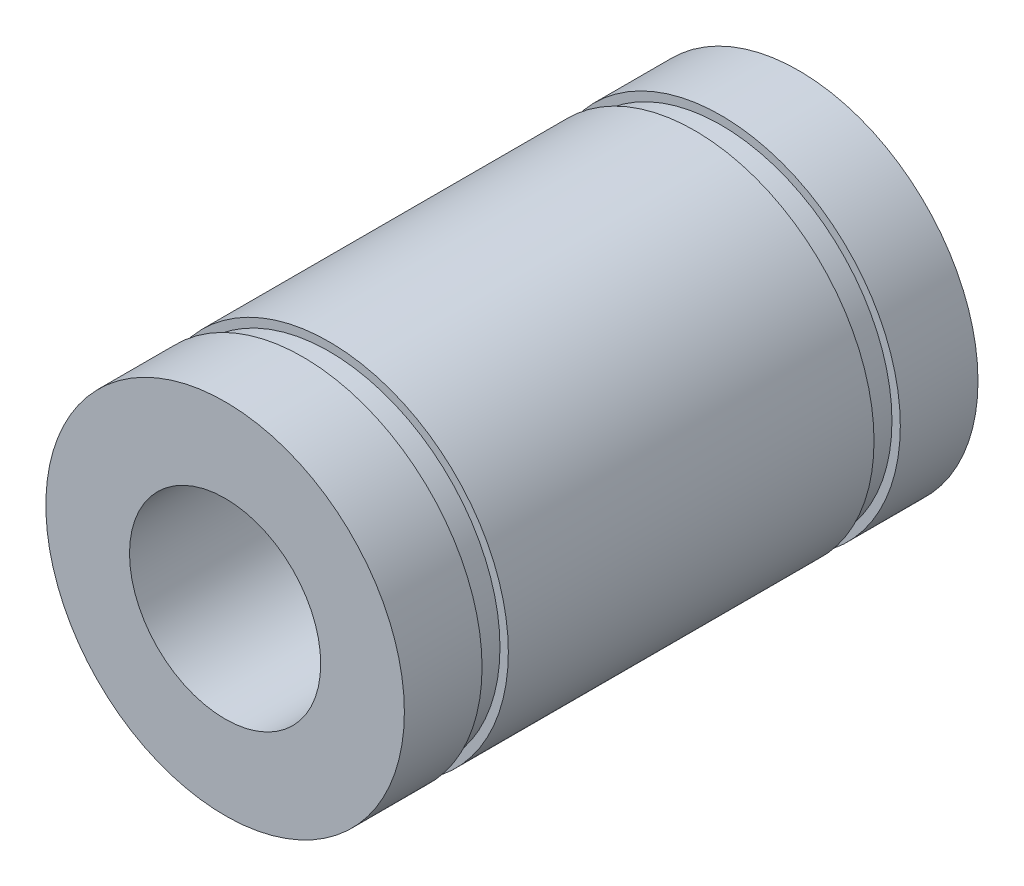
ISO-10303-21;
HEADER;
FILE_DESCRIPTION(('STEP AP214'),'2;1');
FILE_NAME('part.step','',(''),(''),'','','');
FILE_SCHEMA(('AUTOMOTIVE_DESIGN { 1 0 10303 214 1 1 1 1 }'));
ENDSEC;
DATA;
#1=APPLICATION_CONTEXT('core data for automotive mechanical design processes');
#2=APPLICATION_PROTOCOL_DEFINITION('international standard','automotive_design',2000,#1);
#3=PRODUCT_CONTEXT('',#1,'mechanical');
#4=PRODUCT('Part','Part','',(#3));
#5=PRODUCT_RELATED_PRODUCT_CATEGORY('part','',(#4));
#6=PRODUCT_DEFINITION_FORMATION('','',#4);
#7=PRODUCT_DEFINITION_CONTEXT('part definition',#1,'design');
#8=PRODUCT_DEFINITION('design','',#6,#7);
#9=PRODUCT_DEFINITION_SHAPE('','',#8);
#10=(LENGTH_UNIT() NAMED_UNIT(*) SI_UNIT(.MILLI.,.METRE.));
#11=(NAMED_UNIT(*) PLANE_ANGLE_UNIT() SI_UNIT($,.RADIAN.));
#12=(NAMED_UNIT(*) SI_UNIT($,.STERADIAN.) SOLID_ANGLE_UNIT());
#13=UNCERTAINTY_MEASURE_WITH_UNIT(LENGTH_MEASURE(1.E-05),#10,'distance_accuracy_value','');
#14=(GEOMETRIC_REPRESENTATION_CONTEXT(3) GLOBAL_UNCERTAINTY_ASSIGNED_CONTEXT((#13)) GLOBAL_UNIT_ASSIGNED_CONTEXT((#10,
#11,#12)) REPRESENTATION_CONTEXT('',''));
#15=CARTESIAN_POINT('',(0.,0.,0.));
#16=DIRECTION('',(0.,0.,1.));
#17=DIRECTION('',(1.,0.,0.));
#18=AXIS2_PLACEMENT_3D('',#15,#16,#17);
#19=CARTESIAN_POINT('',(0.,0.,-12.));
#20=DIRECTION('',(0.,0.,1.));
#21=DIRECTION('',(1.,0.,0.));
#22=AXIS2_PLACEMENT_3D('',#19,#20,#21);
#23=CYLINDRICAL_SURFACE('',#22,7.5);
#24=CARTESIAN_POINT('',(0.,0.,-12.));
#25=DIRECTION('',(0.,0.,1.));
#26=DIRECTION('',(1.,0.,0.));
#27=AXIS2_PLACEMENT_3D('',#24,#25,#26);
#28=CIRCLE('',#27,7.5);
#29=CARTESIAN_POINT('',(7.5,0.,-12.));
#30=VERTEX_POINT('',#29);
#31=EDGE_CURVE('E10',#30,#30,#28,.T.);
#32=ORIENTED_EDGE('',*,*,#31,.T.);
#33=EDGE_LOOP('',(#32));
#34=FACE_BOUND('',#33,.T.);
#35=CARTESIAN_POINT('',(0.,0.,-8.75000000000004));
#36=DIRECTION('',(0.,0.,1.));
#37=DIRECTION('',(1.,0.,0.));
#38=AXIS2_PLACEMENT_3D('',#35,#36,#37);
#39=CIRCLE('',#38,7.5);
#40=CARTESIAN_POINT('',(7.5,0.,-8.75000000000004));
#41=VERTEX_POINT('',#40);
#42=EDGE_CURVE('E69',#41,#41,#39,.T.);
#43=ORIENTED_EDGE('',*,*,#42,.F.);
#44=EDGE_LOOP('',(#43));
#45=FACE_BOUND('',#44,.T.);
#46=ADVANCED_FACE('F30',(#34,#45),#23,.T.);
#47=CARTESIAN_POINT('',(0.,0.,7.65000000000005));
#48=DIRECTION('',(0.,0.,1.));
#49=DIRECTION('',(1.,0.,0.));
#50=AXIS2_PLACEMENT_3D('',#47,#48,#49);
#51=CIRCLE('',#50,7.5);
#52=CARTESIAN_POINT('',(7.5,0.,7.65000000000005));
#53=VERTEX_POINT('',#52);
#54=EDGE_CURVE('E54',#53,#53,#51,.T.);
#55=ORIENTED_EDGE('',*,*,#54,.F.);
#56=EDGE_LOOP('',(#55));
#57=FACE_BOUND('',#56,.T.);
#58=CARTESIAN_POINT('',(0.,0.,-7.65000000000005));
#59=DIRECTION('',(0.,0.,1.));
#60=DIRECTION('',(1.,0.,0.));
#61=AXIS2_PLACEMENT_3D('',#58,#59,#60);
#62=CIRCLE('',#61,7.5);
#63=CARTESIAN_POINT('',(7.5,0.,-7.65000000000005));
#64=VERTEX_POINT('',#63);
#65=EDGE_CURVE('E66',#64,#64,#62,.T.);
#66=ORIENTED_EDGE('',*,*,#65,.T.);
#67=EDGE_LOOP('',(#66));
#68=FACE_BOUND('',#67,.T.);
#69=ADVANCED_FACE('F76',(#57,#68),#23,.T.);
#70=CARTESIAN_POINT('',(0.,0.,12.));
#71=DIRECTION('',(0.,0.,1.));
#72=DIRECTION('',(1.,0.,0.));
#73=AXIS2_PLACEMENT_3D('',#70,#71,#72);
#74=CIRCLE('',#73,7.5);
#75=CARTESIAN_POINT('',(7.5,0.,12.));
#76=VERTEX_POINT('',#75);
#77=EDGE_CURVE('E34',#76,#76,#74,.T.);
#78=ORIENTED_EDGE('',*,*,#77,.F.);
#79=EDGE_LOOP('',(#78));
#80=FACE_BOUND('',#79,.T.);
#81=CARTESIAN_POINT('',(0.,0.,8.75000000000004));
#82=DIRECTION('',(0.,0.,1.));
#83=DIRECTION('',(1.,0.,0.));
#84=AXIS2_PLACEMENT_3D('',#81,#82,#83);
#85=CIRCLE('',#84,7.5);
#86=CARTESIAN_POINT('',(7.5,0.,8.75000000000004));
#87=VERTEX_POINT('',#86);
#88=EDGE_CURVE('E57',#87,#87,#85,.T.);
#89=ORIENTED_EDGE('',*,*,#88,.T.);
#90=EDGE_LOOP('',(#89));
#91=FACE_BOUND('',#90,.T.);
#92=ADVANCED_FACE('F32',(#80,#91),#23,.T.);
#93=CARTESIAN_POINT('',(0.,0.,-12.));
#94=DIRECTION('',(0.,0.,1.));
#95=DIRECTION('',(1.,0.,0.));
#96=AXIS2_PLACEMENT_3D('',#93,#94,#95);
#97=PLANE('',#96);
#98=CARTESIAN_POINT('',(0.,0.,-12.));
#99=DIRECTION('',(0.,0.,1.));
#100=DIRECTION('',(1.,0.,0.));
#101=AXIS2_PLACEMENT_3D('',#98,#99,#100);
#102=CIRCLE('',#101,4.);
#103=CARTESIAN_POINT('',(4.,0.,-12.));
#104=VERTEX_POINT('',#103);
#105=EDGE_CURVE('E41',#104,#104,#102,.T.);
#106=ORIENTED_EDGE('',*,*,#105,.T.);
#107=EDGE_LOOP('',(#106));
#108=FACE_BOUND('',#107,.T.);
#109=ORIENTED_EDGE('',*,*,#31,.F.);
#110=EDGE_LOOP('',(#109));
#111=FACE_BOUND('',#110,.T.);
#112=ADVANCED_FACE('F82',(#108,#111),#97,.F.);
#113=CARTESIAN_POINT('',(0.,0.,12.));
#114=DIRECTION('',(0.,0.,1.));
#115=DIRECTION('',(1.,0.,0.));
#116=AXIS2_PLACEMENT_3D('',#113,#114,#115);
#117=PLANE('',#116);
#118=CARTESIAN_POINT('',(0.,0.,12.));
#119=DIRECTION('',(0.,0.,1.));
#120=DIRECTION('',(1.,0.,0.));
#121=AXIS2_PLACEMENT_3D('',#118,#119,#120);
#122=CIRCLE('',#121,4.);
#123=CARTESIAN_POINT('',(4.,0.,12.));
#124=VERTEX_POINT('',#123);
#125=EDGE_CURVE('E43',#124,#124,#122,.T.);
#126=ORIENTED_EDGE('',*,*,#125,.F.);
#127=EDGE_LOOP('',(#126));
#128=FACE_BOUND('',#127,.T.);
#129=ORIENTED_EDGE('',*,*,#77,.T.);
#130=EDGE_LOOP('',(#129));
#131=FACE_BOUND('',#130,.T.);
#132=ADVANCED_FACE('F87',(#128,#131),#117,.T.);
#133=CARTESIAN_POINT('',(0.,0.,-12.));
#134=DIRECTION('',(0.,0.,1.));
#135=DIRECTION('',(1.,0.,0.));
#136=AXIS2_PLACEMENT_3D('',#133,#134,#135);
#137=CYLINDRICAL_SURFACE('',#136,4.);
#138=ORIENTED_EDGE('',*,*,#105,.F.);
#139=EDGE_LOOP('',(#138));
#140=FACE_BOUND('',#139,.T.);
#141=ORIENTED_EDGE('',*,*,#125,.T.);
#142=EDGE_LOOP('',(#141));
#143=FACE_BOUND('',#142,.T.);
#144=ADVANCED_FACE('F97',(#140,#143),#137,.F.);
#145=CARTESIAN_POINT('',(0.,7.5,8.75));
#146=DIRECTION('',(0.,0.,-1.));
#147=DIRECTION('',(-1.,0.,0.));
#148=AXIS2_PLACEMENT_3D('',#145,#146,#147);
#149=PLANE('',#148);
#150=CARTESIAN_POINT('',(0.,0.,8.75000000000004));
#151=DIRECTION('',(0.,0.,1.));
#152=DIRECTION('',(1.,0.,0.));
#153=AXIS2_PLACEMENT_3D('',#150,#151,#152);
#154=CIRCLE('',#153,7.15);
#155=CARTESIAN_POINT('',(7.15,0.,8.75000000000004));
#156=VERTEX_POINT('',#155);
#157=EDGE_CURVE('E46',#156,#156,#154,.T.);
#158=ORIENTED_EDGE('',*,*,#157,.T.);
#159=EDGE_LOOP('',(#158));
#160=FACE_BOUND('',#159,.T.);
#161=ORIENTED_EDGE('',*,*,#88,.F.);
#162=EDGE_LOOP('',(#161));
#163=FACE_BOUND('',#162,.T.);
#164=ADVANCED_FACE('F94',(#160,#163),#149,.T.);
#165=CARTESIAN_POINT('',(0.,0.,1000.));
#166=DIRECTION('',(0.,0.,1.));
#167=DIRECTION('',(1.,0.,0.));
#168=AXIS2_PLACEMENT_3D('',#165,#166,#167);
#169=CYLINDRICAL_SURFACE('',#168,7.15);
#170=CARTESIAN_POINT('',(0.,0.,7.65000000000005));
#171=DIRECTION('',(0.,0.,1.));
#172=DIRECTION('',(1.,0.,0.));
#173=AXIS2_PLACEMENT_3D('',#170,#171,#172);
#174=CIRCLE('',#173,7.15);
#175=CARTESIAN_POINT('',(7.15,0.,7.65000000000005));
#176=VERTEX_POINT('',#175);
#177=EDGE_CURVE('E51',#176,#176,#174,.T.);
#178=ORIENTED_EDGE('',*,*,#177,.T.);
#179=EDGE_LOOP('',(#178));
#180=FACE_BOUND('',#179,.T.);
#181=ORIENTED_EDGE('',*,*,#157,.F.);
#182=EDGE_LOOP('',(#181));
#183=FACE_BOUND('',#182,.T.);
#184=ADVANCED_FACE('F96',(#180,#183),#169,.T.);
#185=CARTESIAN_POINT('',(0.,7.5,7.65));
#186=DIRECTION('',(0.,0.,1.));
#187=DIRECTION('',(1.,0.,0.));
#188=AXIS2_PLACEMENT_3D('',#185,#186,#187);
#189=PLANE('',#188);
#190=ORIENTED_EDGE('',*,*,#54,.T.);
#191=EDGE_LOOP('',(#190));
#192=FACE_BOUND('',#191,.T.);
#193=ORIENTED_EDGE('',*,*,#177,.F.);
#194=EDGE_LOOP('',(#193));
#195=FACE_BOUND('',#194,.T.);
#196=ADVANCED_FACE('F104',(#192,#195),#189,.T.);
#197=CARTESIAN_POINT('',(0.,7.5,-8.75));
#198=DIRECTION('',(0.,0.,1.));
#199=DIRECTION('',(-1.,0.,0.));
#200=AXIS2_PLACEMENT_3D('',#197,#198,#199);
#201=PLANE('',#200);
#202=CARTESIAN_POINT('',(0.,0.,-8.75000000000004));
#203=DIRECTION('',(0.,0.,1.));
#204=DIRECTION('',(1.,0.,0.));
#205=AXIS2_PLACEMENT_3D('',#202,#203,#204);
#206=CIRCLE('',#205,7.15);
#207=CARTESIAN_POINT('',(7.15,0.,-8.75000000000004));
#208=VERTEX_POINT('',#207);
#209=EDGE_CURVE('E60',#208,#208,#206,.T.);
#210=ORIENTED_EDGE('',*,*,#209,.F.);
#211=EDGE_LOOP('',(#210));
#212=FACE_BOUND('',#211,.T.);
#213=ORIENTED_EDGE('',*,*,#42,.T.);
#214=EDGE_LOOP('',(#213));
#215=FACE_BOUND('',#214,.T.);
#216=ADVANCED_FACE('F73',(#212,#215),#201,.T.);
#217=CARTESIAN_POINT('',(0.,0.,-1000.));
#218=DIRECTION('',(0.,0.,-1.));
#219=DIRECTION('',(1.,0.,0.));
#220=AXIS2_PLACEMENT_3D('',#217,#218,#219);
#221=CYLINDRICAL_SURFACE('',#220,7.15);
#222=CARTESIAN_POINT('',(0.,0.,-7.65000000000005));
#223=DIRECTION('',(0.,0.,1.));
#224=DIRECTION('',(1.,0.,0.));
#225=AXIS2_PLACEMENT_3D('',#222,#223,#224);
#226=CIRCLE('',#225,7.15);
#227=CARTESIAN_POINT('',(7.15,0.,-7.65000000000005));
#228=VERTEX_POINT('',#227);
#229=EDGE_CURVE('E63',#228,#228,#226,.T.);
#230=ORIENTED_EDGE('',*,*,#229,.F.);
#231=EDGE_LOOP('',(#230));
#232=FACE_BOUND('',#231,.T.);
#233=ORIENTED_EDGE('',*,*,#209,.T.);
#234=EDGE_LOOP('',(#233));
#235=FACE_BOUND('',#234,.T.);
#236=ADVANCED_FACE('F164',(#232,#235),#221,.T.);
#237=CARTESIAN_POINT('',(0.,7.5,-7.65));
#238=DIRECTION('',(0.,0.,-1.));
#239=DIRECTION('',(1.,0.,0.));
#240=AXIS2_PLACEMENT_3D('',#237,#238,#239);
#241=PLANE('',#240);
#242=ORIENTED_EDGE('',*,*,#65,.F.);
#243=EDGE_LOOP('',(#242));
#244=FACE_BOUND('',#243,.T.);
#245=ORIENTED_EDGE('',*,*,#229,.T.);
#246=EDGE_LOOP('',(#245));
#247=FACE_BOUND('',#246,.T.);
#248=ADVANCED_FACE('F174',(#244,#247),#241,.T.);
#249=CLOSED_SHELL('',(#46,#69,#92,#112,#132,#144,#164,#184,#196,#216,#236,#248));
#250=MANIFOLD_SOLID_BREP('B2',#249);
#251=ADVANCED_BREP_SHAPE_REPRESENTATION('',(#18,#250),#14);
#252=SHAPE_DEFINITION_REPRESENTATION(#9,#251);
ENDSEC;
END-ISO-10303-21;
